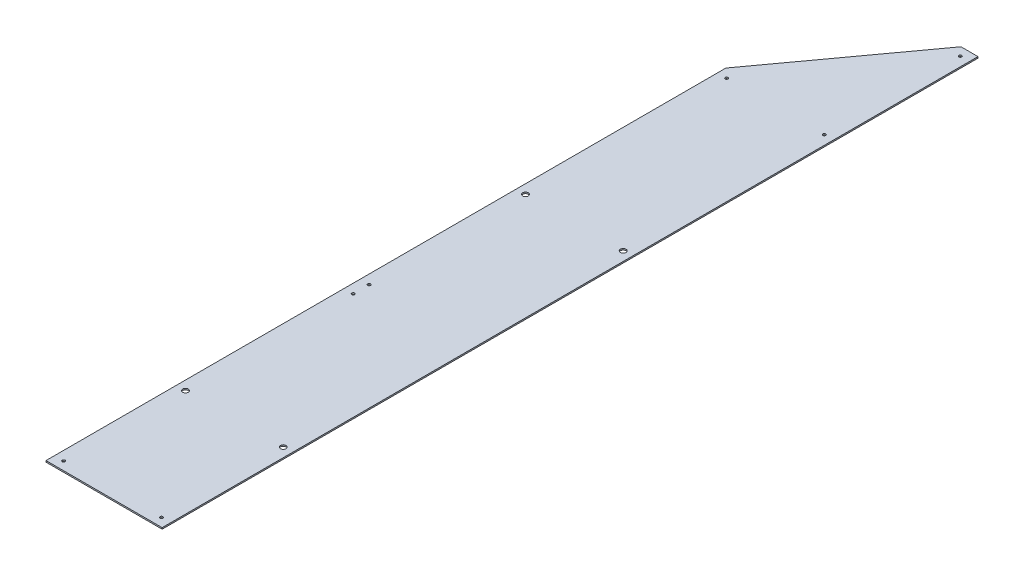
ISO-10303-21;
HEADER;
FILE_DESCRIPTION(('STEP AP214'),'2;1');
FILE_NAME('part.step','',(''),(''),'','','');
FILE_SCHEMA(('AUTOMOTIVE_DESIGN { 1 0 10303 214 1 1 1 1 }'));
ENDSEC;
DATA;
#1=APPLICATION_CONTEXT('core data for automotive mechanical design processes');
#2=APPLICATION_PROTOCOL_DEFINITION('international standard','automotive_design',2000,#1);
#3=PRODUCT_CONTEXT('',#1,'mechanical');
#4=PRODUCT('Part','Part','',(#3));
#5=PRODUCT_RELATED_PRODUCT_CATEGORY('part','',(#4));
#6=PRODUCT_DEFINITION_FORMATION('','',#4);
#7=PRODUCT_DEFINITION_CONTEXT('part definition',#1,'design');
#8=PRODUCT_DEFINITION('design','',#6,#7);
#9=PRODUCT_DEFINITION_SHAPE('','',#8);
#10=(LENGTH_UNIT() NAMED_UNIT(*) SI_UNIT(.MILLI.,.METRE.));
#11=(NAMED_UNIT(*) PLANE_ANGLE_UNIT() SI_UNIT($,.RADIAN.));
#12=(NAMED_UNIT(*) SI_UNIT($,.STERADIAN.) SOLID_ANGLE_UNIT());
#13=UNCERTAINTY_MEASURE_WITH_UNIT(LENGTH_MEASURE(1.E-05),#10,'distance_accuracy_value','');
#14=(GEOMETRIC_REPRESENTATION_CONTEXT(3) GLOBAL_UNCERTAINTY_ASSIGNED_CONTEXT((#13)) GLOBAL_UNIT_ASSIGNED_CONTEXT((#10,
#11,#12)) REPRESENTATION_CONTEXT('',''));
#15=CARTESIAN_POINT('',(0.,0.,0.));
#16=DIRECTION('',(0.,0.,1.));
#17=DIRECTION('',(1.,0.,0.));
#18=AXIS2_PLACEMENT_3D('',#15,#16,#17);
#19=CARTESIAN_POINT('',(-65.0875,-1.5875,457.2));
#20=DIRECTION('',(-1.,0.,0.));
#21=DIRECTION('',(0.,0.,1.));
#22=AXIS2_PLACEMENT_3D('',#19,#20,#21);
#23=PLANE('',#22);
#24=DIRECTION('',(0.,0.,1.));
#25=VECTOR('',#24,1.);
#26=CARTESIAN_POINT('',(-65.0875,0.,457.2));
#27=LINE('',#26,#25);
#28=CARTESIAN_POINT('',(-65.0875,0.,-304.8));
#29=VERTEX_POINT('',#28);
#30=CARTESIAN_POINT('',(-65.0875,0.,457.2));
#31=VERTEX_POINT('',#30);
#32=EDGE_CURVE('E106',#29,#31,#27,.T.);
#33=ORIENTED_EDGE('',*,*,#32,.F.);
#34=DIRECTION('',(0.,-1.,0.));
#35=VECTOR('',#34,1.);
#36=CARTESIAN_POINT('',(-65.0875,0.,-304.8));
#37=LINE('',#36,#35);
#38=CARTESIAN_POINT('',(-65.0875,-1.5875,-304.8));
#39=VERTEX_POINT('',#38);
#40=EDGE_CURVE('E52',#29,#39,#37,.T.);
#41=ORIENTED_EDGE('',*,*,#40,.T.);
#42=DIRECTION('',(0.,0.,1.));
#43=VECTOR('',#42,1.);
#44=CARTESIAN_POINT('',(-65.0875,-1.5875,457.2));
#45=LINE('',#44,#43);
#46=CARTESIAN_POINT('',(-65.0875,-1.5875,457.2));
#47=VERTEX_POINT('',#46);
#48=EDGE_CURVE('E119',#39,#47,#45,.T.);
#49=ORIENTED_EDGE('',*,*,#48,.T.);
#50=DIRECTION('',(0.,1.,0.));
#51=VECTOR('',#50,1.);
#52=CARTESIAN_POINT('',(-65.0875,-1.5875,457.2));
#53=LINE('',#52,#51);
#54=EDGE_CURVE('E44',#47,#31,#53,.T.);
#55=ORIENTED_EDGE('',*,*,#54,.T.);
#56=EDGE_LOOP('',(#33,#41,#49,#55));
#57=FACE_BOUND('',#56,.T.);
#58=ADVANCED_FACE('F35',(#57),#23,.T.);
#59=CARTESIAN_POINT('',(-65.0875,-1.5875,-457.2));
#60=DIRECTION('',(0.,0.,-1.));
#61=DIRECTION('',(-1.,0.,0.));
#62=AXIS2_PLACEMENT_3D('',#59,#60,#61);
#63=PLANE('',#62);
#64=DIRECTION('',(-1.,0.,0.));
#65=VECTOR('',#64,1.);
#66=CARTESIAN_POINT('',(-65.0875,-1.5875,-457.2));
#67=LINE('',#66,#65);
#68=CARTESIAN_POINT('',(65.0875,-1.5875,-457.2));
#69=VERTEX_POINT('',#68);
#70=CARTESIAN_POINT('',(46.0375,-1.5875,-457.2));
#71=VERTEX_POINT('',#70);
#72=EDGE_CURVE('E100',#69,#71,#67,.T.);
#73=ORIENTED_EDGE('',*,*,#72,.T.);
#74=DIRECTION('',(0.,-1.,0.));
#75=VECTOR('',#74,1.);
#76=CARTESIAN_POINT('',(46.0375,0.,-457.2));
#77=LINE('',#76,#75);
#78=CARTESIAN_POINT('',(46.0375,0.,-457.2));
#79=VERTEX_POINT('',#78);
#80=EDGE_CURVE('E90',#79,#71,#77,.T.);
#81=ORIENTED_EDGE('',*,*,#80,.F.);
#82=DIRECTION('',(-1.,0.,0.));
#83=VECTOR('',#82,1.);
#84=CARTESIAN_POINT('',(-65.0875,0.,-457.2));
#85=LINE('',#84,#83);
#86=CARTESIAN_POINT('',(65.0875,0.,-457.2));
#87=VERTEX_POINT('',#86);
#88=EDGE_CURVE('E98',#87,#79,#85,.T.);
#89=ORIENTED_EDGE('',*,*,#88,.F.);
#90=DIRECTION('',(0.,1.,0.));
#91=VECTOR('',#90,1.);
#92=CARTESIAN_POINT('',(65.0875,-1.5875,-457.2));
#93=LINE('',#92,#91);
#94=EDGE_CURVE('E39',#69,#87,#93,.T.);
#95=ORIENTED_EDGE('',*,*,#94,.F.);
#96=EDGE_LOOP('',(#73,#81,#89,#95));
#97=FACE_BOUND('',#96,.T.);
#98=ADVANCED_FACE('F97',(#97),#63,.T.);
#99=CARTESIAN_POINT('',(0.,-1.5875,0.));
#100=DIRECTION('',(0.,-1.,0.));
#101=DIRECTION('',(0.,0.,-1.));
#102=AXIS2_PLACEMENT_3D('',#99,#100,#101);
#103=PLANE('',#102);
#104=CARTESIAN_POINT('',(-54.76875,-1.5875,105.41));
#105=DIRECTION('',(0.,-1.,0.));
#106=DIRECTION('',(0.,0.,-1.));
#107=AXIS2_PLACEMENT_3D('',#104,#105,#106);
#108=CIRCLE('',#107,1.5875);
#109=CARTESIAN_POINT('',(-54.76875,-1.5875,103.8225));
#110=VERTEX_POINT('',#109);
#111=EDGE_CURVE('E178',#110,#110,#108,.T.);
#112=ORIENTED_EDGE('',*,*,#111,.F.);
#113=EDGE_LOOP('',(#112));
#114=FACE_BOUND('',#113,.T.);
#115=CARTESIAN_POINT('',(-54.76875,-1.5875,123.19));
#116=DIRECTION('',(0.,-1.,0.));
#117=DIRECTION('',(0.,0.,-1.));
#118=AXIS2_PLACEMENT_3D('',#115,#116,#117);
#119=CIRCLE('',#118,1.5875);
#120=CARTESIAN_POINT('',(-54.76875,-1.5875,121.6025));
#121=VERTEX_POINT('',#120);
#122=EDGE_CURVE('E182',#121,#121,#119,.T.);
#123=ORIENTED_EDGE('',*,*,#122,.F.);
#124=EDGE_LOOP('',(#123));
#125=FACE_BOUND('',#124,.T.);
#126=CARTESIAN_POINT('',(54.76875,-1.5875,311.15));
#127=DIRECTION('',(0.,1.,0.));
#128=DIRECTION('',(0.,0.,1.));
#129=AXIS2_PLACEMENT_3D('',#126,#127,#128);
#130=CIRCLE('',#129,3.175);
#131=CARTESIAN_POINT('',(54.76875,-1.5875,314.325));
#132=VERTEX_POINT('',#131);
#133=EDGE_CURVE('E135',#132,#132,#130,.T.);
#134=ORIENTED_EDGE('',*,*,#133,.T.);
#135=EDGE_LOOP('',(#134));
#136=FACE_BOUND('',#135,.T.);
#137=CARTESIAN_POINT('',(54.76875,-1.5875,-447.675));
#138=DIRECTION('',(0.,1.,0.));
#139=DIRECTION('',(0.,0.,1.));
#140=AXIS2_PLACEMENT_3D('',#137,#138,#139);
#141=CIRCLE('',#140,1.5875);
#142=CARTESIAN_POINT('',(54.76875,-1.5875,-446.0875));
#143=VERTEX_POINT('',#142);
#144=EDGE_CURVE('E128',#143,#143,#141,.T.);
#145=ORIENTED_EDGE('',*,*,#144,.T.);
#146=EDGE_LOOP('',(#145));
#147=FACE_BOUND('',#146,.T.);
#148=CARTESIAN_POINT('',(54.76875,-1.5875,-69.85));
#149=DIRECTION('',(0.,1.,0.));
#150=DIRECTION('',(0.,0.,1.));
#151=AXIS2_PLACEMENT_3D('',#148,#149,#150);
#152=CIRCLE('',#151,3.175);
#153=CARTESIAN_POINT('',(54.76875,-1.5875,-66.675));
#154=VERTEX_POINT('',#153);
#155=EDGE_CURVE('E129',#154,#154,#152,.T.);
#156=ORIENTED_EDGE('',*,*,#155,.T.);
#157=EDGE_LOOP('',(#156));
#158=FACE_BOUND('',#157,.T.);
#159=CARTESIAN_POINT('',(54.76875,-1.5875,-295.275));
#160=DIRECTION('',(0.,1.,0.));
#161=DIRECTION('',(0.,0.,1.));
#162=AXIS2_PLACEMENT_3D('',#159,#160,#161);
#163=CIRCLE('',#162,1.5875);
#164=CARTESIAN_POINT('',(54.76875,-1.5875,-293.6875));
#165=VERTEX_POINT('',#164);
#166=EDGE_CURVE('E142',#165,#165,#163,.T.);
#167=ORIENTED_EDGE('',*,*,#166,.T.);
#168=EDGE_LOOP('',(#167));
#169=FACE_BOUND('',#168,.T.);
#170=CARTESIAN_POINT('',(54.76875,-1.5875,447.675));
#171=DIRECTION('',(0.,1.,0.));
#172=DIRECTION('',(0.,0.,1.));
#173=AXIS2_PLACEMENT_3D('',#170,#171,#172);
#174=CIRCLE('',#173,1.58749999999999);
#175=CARTESIAN_POINT('',(54.76875,-1.5875,449.2625));
#176=VERTEX_POINT('',#175);
#177=EDGE_CURVE('E110',#176,#176,#174,.T.);
#178=ORIENTED_EDGE('',*,*,#177,.T.);
#179=EDGE_LOOP('',(#178));
#180=FACE_BOUND('',#179,.T.);
#181=CARTESIAN_POINT('',(-54.76875,-1.5875,311.15));
#182=DIRECTION('',(0.,-1.,0.));
#183=DIRECTION('',(0.,0.,1.));
#184=AXIS2_PLACEMENT_3D('',#181,#182,#183);
#185=CIRCLE('',#184,3.175);
#186=CARTESIAN_POINT('',(-54.76875,-1.5875,314.325));
#187=VERTEX_POINT('',#186);
#188=EDGE_CURVE('E158',#187,#187,#185,.T.);
#189=ORIENTED_EDGE('',*,*,#188,.F.);
#190=EDGE_LOOP('',(#189));
#191=FACE_BOUND('',#190,.T.);
#192=CARTESIAN_POINT('',(-54.76875,-1.5875,-69.85));
#193=DIRECTION('',(0.,-1.,0.));
#194=DIRECTION('',(0.,0.,1.));
#195=AXIS2_PLACEMENT_3D('',#192,#193,#194);
#196=CIRCLE('',#195,3.175);
#197=CARTESIAN_POINT('',(-54.76875,-1.5875,-66.675));
#198=VERTEX_POINT('',#197);
#199=EDGE_CURVE('E159',#198,#198,#196,.T.);
#200=ORIENTED_EDGE('',*,*,#199,.F.);
#201=EDGE_LOOP('',(#200));
#202=FACE_BOUND('',#201,.T.);
#203=CARTESIAN_POINT('',(-54.76875,-1.5875,-295.275));
#204=DIRECTION('',(0.,-1.,0.));
#205=DIRECTION('',(0.,0.,1.));
#206=AXIS2_PLACEMENT_3D('',#203,#204,#205);
#207=CIRCLE('',#206,1.5875);
#208=CARTESIAN_POINT('',(-54.76875,-1.5875,-293.6875));
#209=VERTEX_POINT('',#208);
#210=EDGE_CURVE('E165',#209,#209,#207,.T.);
#211=ORIENTED_EDGE('',*,*,#210,.F.);
#212=EDGE_LOOP('',(#211));
#213=FACE_BOUND('',#212,.T.);
#214=CARTESIAN_POINT('',(-54.76875,-1.5875,447.675));
#215=DIRECTION('',(0.,-1.,0.));
#216=DIRECTION('',(0.,0.,1.));
#217=AXIS2_PLACEMENT_3D('',#214,#215,#216);
#218=CIRCLE('',#217,1.58749999999999);
#219=CARTESIAN_POINT('',(-54.76875,-1.5875,449.2625));
#220=VERTEX_POINT('',#219);
#221=EDGE_CURVE('E143',#220,#220,#218,.T.);
#222=ORIENTED_EDGE('',*,*,#221,.F.);
#223=EDGE_LOOP('',(#222));
#224=FACE_BOUND('',#223,.T.);
#225=ORIENTED_EDGE('',*,*,#48,.F.);
#226=DIRECTION('',(0.589172157449442,0.,-0.808007530216378));
#227=VECTOR('',#226,1.);
#228=CARTESIAN_POINT('',(-187.595806177387,-1.5875,-136.788608671012));
#229=LINE('',#228,#227);
#230=EDGE_CURVE('E95',#39,#71,#229,.T.);
#231=ORIENTED_EDGE('',*,*,#230,.T.);
#232=ORIENTED_EDGE('',*,*,#72,.F.);
#233=DIRECTION('',(0.,0.,-1.));
#234=VECTOR('',#233,1.);
#235=CARTESIAN_POINT('',(65.0875,-1.5875,457.2));
#236=LINE('',#235,#234);
#237=CARTESIAN_POINT('',(65.0875,-1.5875,457.2));
#238=VERTEX_POINT('',#237);
#239=EDGE_CURVE('E114',#238,#69,#236,.T.);
#240=ORIENTED_EDGE('',*,*,#239,.F.);
#241=DIRECTION('',(1.,0.,0.));
#242=VECTOR('',#241,1.);
#243=CARTESIAN_POINT('',(-65.0875,-1.5875,457.2));
#244=LINE('',#243,#242);
#245=EDGE_CURVE('E118',#47,#238,#244,.T.);
#246=ORIENTED_EDGE('',*,*,#245,.F.);
#247=EDGE_LOOP('',(#225,#231,#232,#240,#246));
#248=FACE_BOUND('',#247,.T.);
#249=ADVANCED_FACE('F209',(#114,#125,#136,#147,#158,#169,#180,#191,#202,#213,#224,#248),#103,.T.);
#250=CARTESIAN_POINT('',(0.,0.,0.));
#251=DIRECTION('',(0.,-1.,0.));
#252=DIRECTION('',(0.,0.,-1.));
#253=AXIS2_PLACEMENT_3D('',#250,#251,#252);
#254=PLANE('',#253);
#255=CARTESIAN_POINT('',(-54.76875,0.,105.41));
#256=DIRECTION('',(0.,-1.,0.));
#257=DIRECTION('',(0.,0.,1.));
#258=AXIS2_PLACEMENT_3D('',#255,#256,#257);
#259=CIRCLE('',#258,1.5875);
#260=CARTESIAN_POINT('',(-54.76875,0.,106.9975));
#261=VERTEX_POINT('',#260);
#262=EDGE_CURVE('E185',#261,#261,#259,.T.);
#263=ORIENTED_EDGE('',*,*,#262,.T.);
#264=EDGE_LOOP('',(#263));
#265=FACE_BOUND('',#264,.T.);
#266=CARTESIAN_POINT('',(-54.76875,0.,123.19));
#267=DIRECTION('',(0.,-1.,0.));
#268=DIRECTION('',(0.,0.,-1.));
#269=AXIS2_PLACEMENT_3D('',#266,#267,#268);
#270=CIRCLE('',#269,1.5875);
#271=CARTESIAN_POINT('',(-54.76875,0.,121.6025));
#272=VERTEX_POINT('',#271);
#273=EDGE_CURVE('E186',#272,#272,#270,.T.);
#274=ORIENTED_EDGE('',*,*,#273,.T.);
#275=EDGE_LOOP('',(#274));
#276=FACE_BOUND('',#275,.T.);
#277=CARTESIAN_POINT('',(54.76875,0.,311.15));
#278=DIRECTION('',(0.,1.,0.));
#279=DIRECTION('',(0.,0.,1.));
#280=AXIS2_PLACEMENT_3D('',#277,#278,#279);
#281=CIRCLE('',#280,3.175);
#282=CARTESIAN_POINT('',(54.76875,0.,314.325));
#283=VERTEX_POINT('',#282);
#284=EDGE_CURVE('E132',#283,#283,#281,.T.);
#285=ORIENTED_EDGE('',*,*,#284,.F.);
#286=EDGE_LOOP('',(#285));
#287=FACE_BOUND('',#286,.T.);
#288=CARTESIAN_POINT('',(54.76875,0.,-447.675));
#289=DIRECTION('',(0.,1.,0.));
#290=DIRECTION('',(0.,0.,1.));
#291=AXIS2_PLACEMENT_3D('',#288,#289,#290);
#292=CIRCLE('',#291,1.5875);
#293=CARTESIAN_POINT('',(54.76875,0.,-446.0875));
#294=VERTEX_POINT('',#293);
#295=EDGE_CURVE('E125',#294,#294,#292,.T.);
#296=ORIENTED_EDGE('',*,*,#295,.F.);
#297=EDGE_LOOP('',(#296));
#298=FACE_BOUND('',#297,.T.);
#299=CARTESIAN_POINT('',(54.76875,0.,-69.85));
#300=DIRECTION('',(0.,1.,0.));
#301=DIRECTION('',(0.,0.,1.));
#302=AXIS2_PLACEMENT_3D('',#299,#300,#301);
#303=CIRCLE('',#302,3.175);
#304=CARTESIAN_POINT('',(54.76875,0.,-66.675));
#305=VERTEX_POINT('',#304);
#306=EDGE_CURVE('E146',#305,#305,#303,.T.);
#307=ORIENTED_EDGE('',*,*,#306,.F.);
#308=EDGE_LOOP('',(#307));
#309=FACE_BOUND('',#308,.T.);
#310=CARTESIAN_POINT('',(54.76875,0.,-295.275));
#311=DIRECTION('',(0.,1.,0.));
#312=DIRECTION('',(0.,0.,1.));
#313=AXIS2_PLACEMENT_3D('',#310,#311,#312);
#314=CIRCLE('',#313,1.5875);
#315=CARTESIAN_POINT('',(54.76875,0.,-293.6875));
#316=VERTEX_POINT('',#315);
#317=EDGE_CURVE('E139',#316,#316,#314,.T.);
#318=ORIENTED_EDGE('',*,*,#317,.F.);
#319=EDGE_LOOP('',(#318));
#320=FACE_BOUND('',#319,.T.);
#321=CARTESIAN_POINT('',(54.76875,0.,447.675));
#322=DIRECTION('',(0.,1.,0.));
#323=DIRECTION('',(0.,0.,1.));
#324=AXIS2_PLACEMENT_3D('',#321,#322,#323);
#325=CIRCLE('',#324,1.58749999999999);
#326=CARTESIAN_POINT('',(54.76875,0.,449.2625));
#327=VERTEX_POINT('',#326);
#328=EDGE_CURVE('E138',#327,#327,#325,.T.);
#329=ORIENTED_EDGE('',*,*,#328,.F.);
#330=EDGE_LOOP('',(#329));
#331=FACE_BOUND('',#330,.T.);
#332=CARTESIAN_POINT('',(-54.76875,0.,311.15));
#333=DIRECTION('',(0.,-1.,0.));
#334=DIRECTION('',(0.,0.,1.));
#335=AXIS2_PLACEMENT_3D('',#332,#333,#334);
#336=CIRCLE('',#335,3.175);
#337=CARTESIAN_POINT('',(-54.76875,0.,314.325));
#338=VERTEX_POINT('',#337);
#339=EDGE_CURVE('E155',#338,#338,#336,.T.);
#340=ORIENTED_EDGE('',*,*,#339,.T.);
#341=EDGE_LOOP('',(#340));
#342=FACE_BOUND('',#341,.T.);
#343=CARTESIAN_POINT('',(-54.76875,0.,-69.85));
#344=DIRECTION('',(0.,-1.,0.));
#345=DIRECTION('',(0.,0.,1.));
#346=AXIS2_PLACEMENT_3D('',#343,#344,#345);
#347=CIRCLE('',#346,3.175);
#348=CARTESIAN_POINT('',(-54.76875,0.,-66.675));
#349=VERTEX_POINT('',#348);
#350=EDGE_CURVE('E168',#349,#349,#347,.T.);
#351=ORIENTED_EDGE('',*,*,#350,.T.);
#352=EDGE_LOOP('',(#351));
#353=FACE_BOUND('',#352,.T.);
#354=CARTESIAN_POINT('',(-54.76875,0.,-295.275));
#355=DIRECTION('',(0.,-1.,0.));
#356=DIRECTION('',(0.,0.,1.));
#357=AXIS2_PLACEMENT_3D('',#354,#355,#356);
#358=CIRCLE('',#357,1.5875);
#359=CARTESIAN_POINT('',(-54.76875,0.,-293.6875));
#360=VERTEX_POINT('',#359);
#361=EDGE_CURVE('E101',#360,#360,#358,.T.);
#362=ORIENTED_EDGE('',*,*,#361,.T.);
#363=EDGE_LOOP('',(#362));
#364=FACE_BOUND('',#363,.T.);
#365=CARTESIAN_POINT('',(-54.76875,0.,447.675));
#366=DIRECTION('',(0.,-1.,0.));
#367=DIRECTION('',(0.,0.,1.));
#368=AXIS2_PLACEMENT_3D('',#365,#366,#367);
#369=CIRCLE('',#368,1.58749999999999);
#370=CARTESIAN_POINT('',(-54.76875,0.,449.2625));
#371=VERTEX_POINT('',#370);
#372=EDGE_CURVE('E162',#371,#371,#369,.T.);
#373=ORIENTED_EDGE('',*,*,#372,.T.);
#374=EDGE_LOOP('',(#373));
#375=FACE_BOUND('',#374,.T.);
#376=DIRECTION('',(0.589172157449442,0.,-0.808007530216378));
#377=VECTOR('',#376,1.);
#378=CARTESIAN_POINT('',(-187.595806177387,0.,-136.788608671012));
#379=LINE('',#378,#377);
#380=EDGE_CURVE('E87',#29,#79,#379,.T.);
#381=ORIENTED_EDGE('',*,*,#380,.F.);
#382=ORIENTED_EDGE('',*,*,#32,.T.);
#383=DIRECTION('',(1.,0.,0.));
#384=VECTOR('',#383,1.);
#385=CARTESIAN_POINT('',(-65.0875,0.,457.2));
#386=LINE('',#385,#384);
#387=CARTESIAN_POINT('',(65.0875,0.,457.2));
#388=VERTEX_POINT('',#387);
#389=EDGE_CURVE('E108',#31,#388,#386,.T.);
#390=ORIENTED_EDGE('',*,*,#389,.T.);
#391=DIRECTION('',(0.,0.,-1.));
#392=VECTOR('',#391,1.);
#393=CARTESIAN_POINT('',(65.0875,0.,457.2));
#394=LINE('',#393,#392);
#395=EDGE_CURVE('E105',#388,#87,#394,.T.);
#396=ORIENTED_EDGE('',*,*,#395,.T.);
#397=ORIENTED_EDGE('',*,*,#88,.T.);
#398=EDGE_LOOP('',(#381,#382,#390,#396,#397));
#399=FACE_BOUND('',#398,.T.);
#400=ADVANCED_FACE('F103',(#265,#276,#287,#298,#309,#320,#331,#342,#353,#364,#375,#399),#254,.F.);
#401=CARTESIAN_POINT('',(65.0875,-1.5875,457.2));
#402=DIRECTION('',(1.,0.,0.));
#403=DIRECTION('',(0.,0.,-1.));
#404=AXIS2_PLACEMENT_3D('',#401,#402,#403);
#405=PLANE('',#404);
#406=ORIENTED_EDGE('',*,*,#395,.F.);
#407=DIRECTION('',(0.,1.,0.));
#408=VECTOR('',#407,1.);
#409=CARTESIAN_POINT('',(65.0875,-1.5875,457.2));
#410=LINE('',#409,#408);
#411=EDGE_CURVE('E11',#238,#388,#410,.T.);
#412=ORIENTED_EDGE('',*,*,#411,.F.);
#413=ORIENTED_EDGE('',*,*,#239,.T.);
#414=ORIENTED_EDGE('',*,*,#94,.T.);
#415=EDGE_LOOP('',(#406,#412,#413,#414));
#416=FACE_BOUND('',#415,.T.);
#417=ADVANCED_FACE('F37',(#416),#405,.T.);
#418=CARTESIAN_POINT('',(-65.0875,-1.5875,457.2));
#419=DIRECTION('',(0.,0.,1.));
#420=DIRECTION('',(1.,0.,0.));
#421=AXIS2_PLACEMENT_3D('',#418,#419,#420);
#422=PLANE('',#421);
#423=ORIENTED_EDGE('',*,*,#389,.F.);
#424=ORIENTED_EDGE('',*,*,#54,.F.);
#425=ORIENTED_EDGE('',*,*,#245,.T.);
#426=ORIENTED_EDGE('',*,*,#411,.T.);
#427=EDGE_LOOP('',(#423,#424,#425,#426));
#428=FACE_BOUND('',#427,.T.);
#429=ADVANCED_FACE('F211',(#428),#422,.T.);
#430=CARTESIAN_POINT('',(54.76875,-1.5875,311.15));
#431=DIRECTION('',(0.,1.,0.));
#432=DIRECTION('',(0.,0.,1.));
#433=AXIS2_PLACEMENT_3D('',#430,#431,#432);
#434=CYLINDRICAL_SURFACE('',#433,3.175);
#435=ORIENTED_EDGE('',*,*,#133,.F.);
#436=EDGE_LOOP('',(#435));
#437=FACE_BOUND('',#436,.T.);
#438=ORIENTED_EDGE('',*,*,#284,.T.);
#439=EDGE_LOOP('',(#438));
#440=FACE_BOUND('',#439,.T.);
#441=ADVANCED_FACE('F214',(#437,#440),#434,.F.);
#442=CARTESIAN_POINT('',(54.76875,-1.5875,-447.675));
#443=DIRECTION('',(0.,1.,0.));
#444=DIRECTION('',(0.,0.,1.));
#445=AXIS2_PLACEMENT_3D('',#442,#443,#444);
#446=CYLINDRICAL_SURFACE('',#445,1.5875);
#447=ORIENTED_EDGE('',*,*,#144,.F.);
#448=EDGE_LOOP('',(#447));
#449=FACE_BOUND('',#448,.T.);
#450=ORIENTED_EDGE('',*,*,#295,.T.);
#451=EDGE_LOOP('',(#450));
#452=FACE_BOUND('',#451,.T.);
#453=ADVANCED_FACE('F220',(#449,#452),#446,.F.);
#454=CARTESIAN_POINT('',(54.76875,-1.5875,-69.85));
#455=DIRECTION('',(0.,1.,0.));
#456=DIRECTION('',(0.,0.,1.));
#457=AXIS2_PLACEMENT_3D('',#454,#455,#456);
#458=CYLINDRICAL_SURFACE('',#457,3.175);
#459=ORIENTED_EDGE('',*,*,#155,.F.);
#460=EDGE_LOOP('',(#459));
#461=FACE_BOUND('',#460,.T.);
#462=ORIENTED_EDGE('',*,*,#306,.T.);
#463=EDGE_LOOP('',(#462));
#464=FACE_BOUND('',#463,.T.);
#465=ADVANCED_FACE('F223',(#461,#464),#458,.F.);
#466=CARTESIAN_POINT('',(54.76875,-1.5875,-295.275));
#467=DIRECTION('',(0.,1.,0.));
#468=DIRECTION('',(0.,0.,1.));
#469=AXIS2_PLACEMENT_3D('',#466,#467,#468);
#470=CYLINDRICAL_SURFACE('',#469,1.5875);
#471=ORIENTED_EDGE('',*,*,#166,.F.);
#472=EDGE_LOOP('',(#471));
#473=FACE_BOUND('',#472,.T.);
#474=ORIENTED_EDGE('',*,*,#317,.T.);
#475=EDGE_LOOP('',(#474));
#476=FACE_BOUND('',#475,.T.);
#477=ADVANCED_FACE('F228',(#473,#476),#470,.F.);
#478=CARTESIAN_POINT('',(54.76875,-1.5875,447.675));
#479=DIRECTION('',(0.,1.,0.));
#480=DIRECTION('',(0.,0.,1.));
#481=AXIS2_PLACEMENT_3D('',#478,#479,#480);
#482=CYLINDRICAL_SURFACE('',#481,1.58749999999999);
#483=ORIENTED_EDGE('',*,*,#177,.F.);
#484=EDGE_LOOP('',(#483));
#485=FACE_BOUND('',#484,.T.);
#486=ORIENTED_EDGE('',*,*,#328,.T.);
#487=EDGE_LOOP('',(#486));
#488=FACE_BOUND('',#487,.T.);
#489=ADVANCED_FACE('F231',(#485,#488),#482,.F.);
#490=CARTESIAN_POINT('',(-54.76875,-1.5875,311.15));
#491=DIRECTION('',(0.,1.,0.));
#492=DIRECTION('',(0.,0.,1.));
#493=AXIS2_PLACEMENT_3D('',#490,#491,#492);
#494=CYLINDRICAL_SURFACE('',#493,3.175);
#495=ORIENTED_EDGE('',*,*,#188,.T.);
#496=EDGE_LOOP('',(#495));
#497=FACE_BOUND('',#496,.T.);
#498=ORIENTED_EDGE('',*,*,#339,.F.);
#499=EDGE_LOOP('',(#498));
#500=FACE_BOUND('',#499,.T.);
#501=ADVANCED_FACE('F238',(#497,#500),#494,.F.);
#502=CARTESIAN_POINT('',(-54.76875,-1.5875,-69.85));
#503=DIRECTION('',(0.,1.,0.));
#504=DIRECTION('',(0.,0.,1.));
#505=AXIS2_PLACEMENT_3D('',#502,#503,#504);
#506=CYLINDRICAL_SURFACE('',#505,3.175);
#507=ORIENTED_EDGE('',*,*,#199,.T.);
#508=EDGE_LOOP('',(#507));
#509=FACE_BOUND('',#508,.T.);
#510=ORIENTED_EDGE('',*,*,#350,.F.);
#511=EDGE_LOOP('',(#510));
#512=FACE_BOUND('',#511,.T.);
#513=ADVANCED_FACE('F242',(#509,#512),#506,.F.);
#514=CARTESIAN_POINT('',(-54.76875,-1.5875,-295.275));
#515=DIRECTION('',(0.,1.,0.));
#516=DIRECTION('',(0.,0.,1.));
#517=AXIS2_PLACEMENT_3D('',#514,#515,#516);
#518=CYLINDRICAL_SURFACE('',#517,1.5875);
#519=ORIENTED_EDGE('',*,*,#210,.T.);
#520=EDGE_LOOP('',(#519));
#521=FACE_BOUND('',#520,.T.);
#522=ORIENTED_EDGE('',*,*,#361,.F.);
#523=EDGE_LOOP('',(#522));
#524=FACE_BOUND('',#523,.T.);
#525=ADVANCED_FACE('F244',(#521,#524),#518,.F.);
#526=CARTESIAN_POINT('',(-54.76875,-1.5875,447.675));
#527=DIRECTION('',(0.,1.,0.));
#528=DIRECTION('',(0.,0.,1.));
#529=AXIS2_PLACEMENT_3D('',#526,#527,#528);
#530=CYLINDRICAL_SURFACE('',#529,1.58749999999999);
#531=ORIENTED_EDGE('',*,*,#221,.T.);
#532=EDGE_LOOP('',(#531));
#533=FACE_BOUND('',#532,.T.);
#534=ORIENTED_EDGE('',*,*,#372,.F.);
#535=EDGE_LOOP('',(#534));
#536=FACE_BOUND('',#535,.T.);
#537=ADVANCED_FACE('F247',(#533,#536),#530,.F.);
#538=CARTESIAN_POINT('',(-187.595806177387,0.,-136.788608671012));
#539=DIRECTION('',(-0.808007530216377,0.,-0.589172157449442));
#540=DIRECTION('',(-0.589172157449442,0.,0.808007530216378));
#541=AXIS2_PLACEMENT_3D('',#538,#539,#540);
#542=PLANE('',#541);
#543=ORIENTED_EDGE('',*,*,#230,.F.);
#544=ORIENTED_EDGE('',*,*,#40,.F.);
#545=ORIENTED_EDGE('',*,*,#380,.T.);
#546=ORIENTED_EDGE('',*,*,#80,.T.);
#547=EDGE_LOOP('',(#543,#544,#545,#546));
#548=FACE_BOUND('',#547,.T.);
#549=ADVANCED_FACE('F89',(#548),#542,.T.);
#550=CARTESIAN_POINT('',(-54.76875,0.,123.19));
#551=DIRECTION('',(0.,-1.,0.));
#552=DIRECTION('',(0.,0.,-1.));
#553=AXIS2_PLACEMENT_3D('',#550,#551,#552);
#554=CYLINDRICAL_SURFACE('',#553,1.5875);
#555=ORIENTED_EDGE('',*,*,#122,.T.);
#556=EDGE_LOOP('',(#555));
#557=FACE_BOUND('',#556,.T.);
#558=ORIENTED_EDGE('',*,*,#273,.F.);
#559=EDGE_LOOP('',(#558));
#560=FACE_BOUND('',#559,.T.);
#561=ADVANCED_FACE('F196',(#557,#560),#554,.F.);
#562=CARTESIAN_POINT('',(-54.76875,0.,105.41));
#563=DIRECTION('',(0.,-1.,0.));
#564=DIRECTION('',(0.,0.,-1.));
#565=AXIS2_PLACEMENT_3D('',#562,#563,#564);
#566=CYLINDRICAL_SURFACE('',#565,1.5875);
#567=ORIENTED_EDGE('',*,*,#111,.T.);
#568=EDGE_LOOP('',(#567));
#569=FACE_BOUND('',#568,.T.);
#570=ORIENTED_EDGE('',*,*,#262,.F.);
#571=EDGE_LOOP('',(#570));
#572=FACE_BOUND('',#571,.T.);
#573=ADVANCED_FACE('F194',(#569,#572),#566,.F.);
#574=CLOSED_SHELL('',(#58,#98,#249,#400,#417,#429,#441,#453,#465,#477,#489,#501,#513,#525,#537,
#549,#561,#573));
#575=MANIFOLD_SOLID_BREP('B2',#574);
#576=ADVANCED_BREP_SHAPE_REPRESENTATION('',(#18,#575),#14);
#577=SHAPE_DEFINITION_REPRESENTATION(#9,#576);
ENDSEC;
END-ISO-10303-21;
